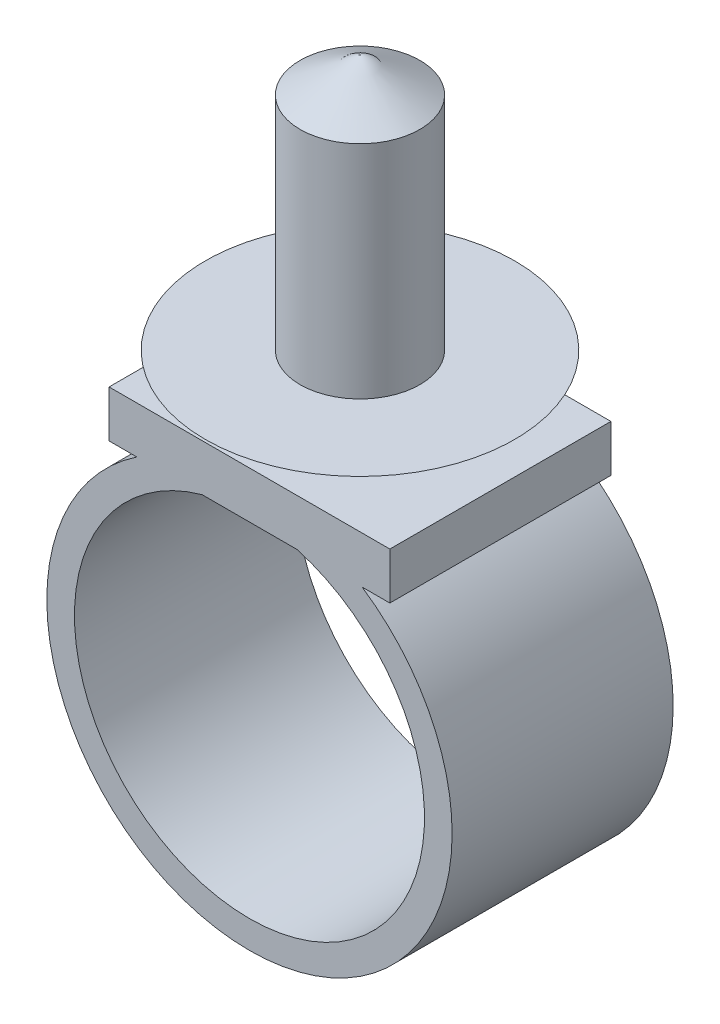
ISO-10303-21;
HEADER;
FILE_DESCRIPTION(('STEP AP214'),'2;1');
FILE_NAME('part.step','',(''),(''),'','','');
FILE_SCHEMA(('AUTOMOTIVE_DESIGN { 1 0 10303 214 1 1 1 1 }'));
ENDSEC;
DATA;
#1=APPLICATION_CONTEXT('core data for automotive mechanical design processes');
#2=APPLICATION_PROTOCOL_DEFINITION('international standard','automotive_design',2000,#1);
#3=PRODUCT_CONTEXT('',#1,'mechanical');
#4=PRODUCT('Part','Part','',(#3));
#5=PRODUCT_RELATED_PRODUCT_CATEGORY('part','',(#4));
#6=PRODUCT_DEFINITION_FORMATION('','',#4);
#7=PRODUCT_DEFINITION_CONTEXT('part definition',#1,'design');
#8=PRODUCT_DEFINITION('design','',#6,#7);
#9=PRODUCT_DEFINITION_SHAPE('','',#8);
#10=(LENGTH_UNIT() NAMED_UNIT(*) SI_UNIT(.MILLI.,.METRE.));
#11=(NAMED_UNIT(*) PLANE_ANGLE_UNIT() SI_UNIT($,.RADIAN.));
#12=(NAMED_UNIT(*) SI_UNIT($,.STERADIAN.) SOLID_ANGLE_UNIT());
#13=UNCERTAINTY_MEASURE_WITH_UNIT(LENGTH_MEASURE(1.E-05),#10,'distance_accuracy_value','');
#14=(GEOMETRIC_REPRESENTATION_CONTEXT(3) GLOBAL_UNCERTAINTY_ASSIGNED_CONTEXT((#13)) GLOBAL_UNIT_ASSIGNED_CONTEXT((#10,
#11,#12)) REPRESENTATION_CONTEXT('',''));
#15=CARTESIAN_POINT('',(0.,0.,0.));
#16=DIRECTION('',(0.,0.,1.));
#17=DIRECTION('',(1.,0.,0.));
#18=AXIS2_PLACEMENT_3D('',#15,#16,#17);
#19=CARTESIAN_POINT('',(0.,0.,12.));
#20=DIRECTION('',(0.,0.,1.));
#21=DIRECTION('',(1.,0.,0.));
#22=AXIS2_PLACEMENT_3D('',#19,#20,#21);
#23=PLANE('',#22);
#24=CARTESIAN_POINT('',(0.,0.,12.));
#25=DIRECTION('',(0.,0.,1.));
#26=DIRECTION('',(1.,0.,0.));
#27=AXIS2_PLACEMENT_3D('',#24,#25,#26);
#28=CIRCLE('',#27,9.5);
#29=CARTESIAN_POINT('',(-2.57628880368642,9.144,12.));
#30=VERTEX_POINT('',#29);
#31=CARTESIAN_POINT('',(2.57628880368642,9.144,12.));
#32=VERTEX_POINT('',#31);
#33=EDGE_CURVE('E185',#30,#32,#28,.T.);
#34=ORIENTED_EDGE('',*,*,#33,.F.);
#35=DIRECTION('',(1.,0.,0.));
#36=VECTOR('',#35,1.);
#37=CARTESIAN_POINT('',(7.62,9.144,12.));
#38=LINE('',#37,#36);
#39=EDGE_CURVE('E155',#30,#32,#38,.T.);
#40=ORIENTED_EDGE('',*,*,#39,.T.);
#41=EDGE_LOOP('',(#34,#40));
#42=FACE_BOUND('',#41,.T.);
#43=CARTESIAN_POINT('',(-7.62,9.144,12.));
#44=VERTEX_POINT('',#43);
#45=CARTESIAN_POINT('',(-6.11451257256046,9.144,12.));
#46=VERTEX_POINT('',#45);
#47=EDGE_CURVE('E150',#44,#46,#38,.T.);
#48=ORIENTED_EDGE('',*,*,#47,.T.);
#49=CARTESIAN_POINT('',(0.,0.,12.));
#50=DIRECTION('',(0.,0.,1.));
#51=DIRECTION('',(1.,0.,0.));
#52=AXIS2_PLACEMENT_3D('',#49,#50,#51);
#53=CIRCLE('',#52,11.);
#54=CARTESIAN_POINT('',(6.11451257256047,9.144,12.));
#55=VERTEX_POINT('',#54);
#56=EDGE_CURVE('E191',#46,#55,#53,.T.);
#57=ORIENTED_EDGE('',*,*,#56,.T.);
#58=CARTESIAN_POINT('',(7.62,9.144,12.));
#59=VERTEX_POINT('',#58);
#60=EDGE_CURVE('E61',#55,#59,#38,.T.);
#61=ORIENTED_EDGE('',*,*,#60,.T.);
#62=DIRECTION('',(0.,-1.,0.));
#63=VECTOR('',#62,1.);
#64=CARTESIAN_POINT('',(7.62,11.684,12.));
#65=LINE('',#64,#63);
#66=CARTESIAN_POINT('',(7.62,11.684,12.));
#67=VERTEX_POINT('',#66);
#68=EDGE_CURVE('E166',#67,#59,#65,.T.);
#69=ORIENTED_EDGE('',*,*,#68,.F.);
#70=DIRECTION('',(1.,0.,0.));
#71=VECTOR('',#70,1.);
#72=CARTESIAN_POINT('',(7.62,11.684,12.));
#73=LINE('',#72,#71);
#74=CARTESIAN_POINT('',(-7.62,11.684,12.));
#75=VERTEX_POINT('',#74);
#76=EDGE_CURVE('E140',#75,#67,#73,.T.);
#77=ORIENTED_EDGE('',*,*,#76,.F.);
#78=DIRECTION('',(0.,-1.,0.));
#79=VECTOR('',#78,1.);
#80=CARTESIAN_POINT('',(-7.62,11.684,12.));
#81=LINE('',#80,#79);
#82=EDGE_CURVE('E170',#75,#44,#81,.T.);
#83=ORIENTED_EDGE('',*,*,#82,.T.);
#84=EDGE_LOOP('',(#48,#57,#61,#69,#77,#83));
#85=FACE_BOUND('',#84,.T.);
#86=ADVANCED_FACE('F43',(#42,#85),#23,.T.);
#87=CARTESIAN_POINT('',(0.,0.,0.));
#88=DIRECTION('',(0.,0.,1.));
#89=DIRECTION('',(1.,0.,0.));
#90=AXIS2_PLACEMENT_3D('',#87,#88,#89);
#91=PLANE('',#90);
#92=DIRECTION('',(-1.,0.,0.));
#93=VECTOR('',#92,1.);
#94=CARTESIAN_POINT('',(0.,9.144,0.));
#95=LINE('',#94,#93);
#96=CARTESIAN_POINT('',(2.57628880368642,9.144,0.));
#97=VERTEX_POINT('',#96);
#98=CARTESIAN_POINT('',(-2.57628880368642,9.144,0.));
#99=VERTEX_POINT('',#98);
#100=EDGE_CURVE('E162',#97,#99,#95,.T.);
#101=ORIENTED_EDGE('',*,*,#100,.T.);
#102=CARTESIAN_POINT('',(0.,0.,0.));
#103=DIRECTION('',(0.,0.,1.));
#104=DIRECTION('',(1.,0.,0.));
#105=AXIS2_PLACEMENT_3D('',#102,#103,#104);
#106=CIRCLE('',#105,9.5);
#107=EDGE_CURVE('E69',#99,#97,#106,.T.);
#108=ORIENTED_EDGE('',*,*,#107,.T.);
#109=EDGE_LOOP('',(#101,#108));
#110=FACE_BOUND('',#109,.T.);
#111=CARTESIAN_POINT('',(0.,0.,0.));
#112=DIRECTION('',(0.,0.,1.));
#113=DIRECTION('',(1.,0.,0.));
#114=AXIS2_PLACEMENT_3D('',#111,#112,#113);
#115=CIRCLE('',#114,11.);
#116=CARTESIAN_POINT('',(-6.11451257256046,9.144,0.));
#117=VERTEX_POINT('',#116);
#118=CARTESIAN_POINT('',(6.11451257256046,9.144,0.));
#119=VERTEX_POINT('',#118);
#120=EDGE_CURVE('E188',#117,#119,#115,.T.);
#121=ORIENTED_EDGE('',*,*,#120,.F.);
#122=CARTESIAN_POINT('',(-7.62,9.144,0.));
#123=VERTEX_POINT('',#122);
#124=EDGE_CURVE('E158',#117,#123,#95,.T.);
#125=ORIENTED_EDGE('',*,*,#124,.T.);
#126=DIRECTION('',(0.,-1.,0.));
#127=VECTOR('',#126,1.);
#128=CARTESIAN_POINT('',(-7.62,11.684,0.));
#129=LINE('',#128,#127);
#130=CARTESIAN_POINT('',(-7.62,11.684,0.));
#131=VERTEX_POINT('',#130);
#132=EDGE_CURVE('E174',#131,#123,#129,.T.);
#133=ORIENTED_EDGE('',*,*,#132,.F.);
#134=DIRECTION('',(-1.,0.,0.));
#135=VECTOR('',#134,1.);
#136=CARTESIAN_POINT('',(-7.62,11.684,0.));
#137=LINE('',#136,#135);
#138=CARTESIAN_POINT('',(7.62,11.684,0.));
#139=VERTEX_POINT('',#138);
#140=EDGE_CURVE('E132',#139,#131,#137,.T.);
#141=ORIENTED_EDGE('',*,*,#140,.F.);
#142=DIRECTION('',(0.,-1.,0.));
#143=VECTOR('',#142,1.);
#144=CARTESIAN_POINT('',(7.62,11.684,0.));
#145=LINE('',#144,#143);
#146=CARTESIAN_POINT('',(7.62,9.144,0.));
#147=VERTEX_POINT('',#146);
#148=EDGE_CURVE('E147',#139,#147,#145,.T.);
#149=ORIENTED_EDGE('',*,*,#148,.T.);
#150=EDGE_CURVE('E137',#147,#119,#95,.T.);
#151=ORIENTED_EDGE('',*,*,#150,.T.);
#152=EDGE_LOOP('',(#121,#125,#133,#141,#149,#151));
#153=FACE_BOUND('',#152,.T.);
#154=ADVANCED_FACE('F209',(#110,#153),#91,.F.);
#155=CARTESIAN_POINT('',(0.,0.,12.));
#156=DIRECTION('',(0.,0.,-1.));
#157=DIRECTION('',(-1.,0.,0.));
#158=AXIS2_PLACEMENT_3D('',#155,#156,#157);
#159=CYLINDRICAL_SURFACE('',#158,11.);
#160=ORIENTED_EDGE('',*,*,#56,.F.);
#161=DIRECTION('',(0.,0.,-1.));
#162=VECTOR('',#161,1.);
#163=CARTESIAN_POINT('',(-6.11451257256047,9.144,12.));
#164=LINE('',#163,#162);
#165=EDGE_CURVE('E181',#46,#117,#164,.T.);
#166=ORIENTED_EDGE('',*,*,#165,.T.);
#167=ORIENTED_EDGE('',*,*,#120,.T.);
#168=DIRECTION('',(0.,0.,-1.));
#169=VECTOR('',#168,1.);
#170=CARTESIAN_POINT('',(6.11451257256047,9.144,12.));
#171=LINE('',#170,#169);
#172=EDGE_CURVE('E178',#119,#55,#171,.F.);
#173=ORIENTED_EDGE('',*,*,#172,.T.);
#174=EDGE_LOOP('',(#160,#166,#167,#173));
#175=FACE_BOUND('',#174,.T.);
#176=ADVANCED_FACE('F45',(#175),#159,.T.);
#177=CARTESIAN_POINT('',(0.,0.,12.));
#178=DIRECTION('',(0.,0.,-1.));
#179=DIRECTION('',(-1.,0.,0.));
#180=AXIS2_PLACEMENT_3D('',#177,#178,#179);
#181=CYLINDRICAL_SURFACE('',#180,9.5);
#182=DIRECTION('',(0.,0.,-1.));
#183=VECTOR('',#182,1.);
#184=CARTESIAN_POINT('',(-2.57628880368642,9.144,12.));
#185=LINE('',#184,#183);
#186=EDGE_CURVE('E47',#30,#99,#185,.T.);
#187=ORIENTED_EDGE('',*,*,#186,.F.);
#188=ORIENTED_EDGE('',*,*,#33,.T.);
#189=DIRECTION('',(0.,0.,-1.));
#190=VECTOR('',#189,1.);
#191=CARTESIAN_POINT('',(2.57628880368642,9.144,12.));
#192=LINE('',#191,#190);
#193=EDGE_CURVE('E195',#97,#32,#192,.F.);
#194=ORIENTED_EDGE('',*,*,#193,.F.);
#195=ORIENTED_EDGE('',*,*,#107,.F.);
#196=EDGE_LOOP('',(#187,#188,#194,#195));
#197=FACE_BOUND('',#196,.T.);
#198=ADVANCED_FACE('F253',(#197),#181,.F.);
#199=CARTESIAN_POINT('',(0.,9.144,0.));
#200=DIRECTION('',(0.,-1.,0.));
#201=DIRECTION('',(0.,0.,-1.));
#202=AXIS2_PLACEMENT_3D('',#199,#200,#201);
#203=PLANE('',#202);
#204=ORIENTED_EDGE('',*,*,#39,.F.);
#205=ORIENTED_EDGE('',*,*,#186,.T.);
#206=ORIENTED_EDGE('',*,*,#100,.F.);
#207=ORIENTED_EDGE('',*,*,#193,.T.);
#208=EDGE_LOOP('',(#204,#205,#206,#207));
#209=FACE_BOUND('',#208,.T.);
#210=ADVANCED_FACE('F206',(#209),#203,.T.);
#211=ORIENTED_EDGE('',*,*,#165,.F.);
#212=ORIENTED_EDGE('',*,*,#47,.F.);
#213=DIRECTION('',(0.,0.,1.));
#214=VECTOR('',#213,1.);
#215=CARTESIAN_POINT('',(-7.62,9.144,12.));
#216=LINE('',#215,#214);
#217=EDGE_CURVE('E126',#123,#44,#216,.T.);
#218=ORIENTED_EDGE('',*,*,#217,.F.);
#219=ORIENTED_EDGE('',*,*,#124,.F.);
#220=EDGE_LOOP('',(#211,#212,#218,#219));
#221=FACE_BOUND('',#220,.T.);
#222=ADVANCED_FACE('F218',(#221),#203,.T.);
#223=ORIENTED_EDGE('',*,*,#172,.F.);
#224=ORIENTED_EDGE('',*,*,#150,.F.);
#225=DIRECTION('',(0.,0.,-1.));
#226=VECTOR('',#225,1.);
#227=CARTESIAN_POINT('',(7.62,9.144,0.));
#228=LINE('',#227,#226);
#229=EDGE_CURVE('E154',#59,#147,#228,.T.);
#230=ORIENTED_EDGE('',*,*,#229,.F.);
#231=ORIENTED_EDGE('',*,*,#60,.F.);
#232=EDGE_LOOP('',(#223,#224,#230,#231));
#233=FACE_BOUND('',#232,.T.);
#234=ADVANCED_FACE('F229',(#233),#203,.T.);
#235=CARTESIAN_POINT('',(-7.62,11.684,12.));
#236=DIRECTION('',(1.,0.,0.));
#237=DIRECTION('',(0.,0.,-1.));
#238=AXIS2_PLACEMENT_3D('',#235,#236,#237);
#239=PLANE('',#238);
#240=ORIENTED_EDGE('',*,*,#217,.T.);
#241=ORIENTED_EDGE('',*,*,#82,.F.);
#242=DIRECTION('',(0.,0.,1.));
#243=VECTOR('',#242,1.);
#244=CARTESIAN_POINT('',(-7.62,11.684,12.));
#245=LINE('',#244,#243);
#246=EDGE_CURVE('E136',#131,#75,#245,.T.);
#247=ORIENTED_EDGE('',*,*,#246,.F.);
#248=ORIENTED_EDGE('',*,*,#132,.T.);
#249=EDGE_LOOP('',(#240,#241,#247,#248));
#250=FACE_BOUND('',#249,.T.);
#251=ADVANCED_FACE('F221',(#250),#239,.F.);
#252=CARTESIAN_POINT('',(7.62,11.684,0.));
#253=DIRECTION('',(-1.,0.,0.));
#254=DIRECTION('',(0.,0.,1.));
#255=AXIS2_PLACEMENT_3D('',#252,#253,#254);
#256=PLANE('',#255);
#257=ORIENTED_EDGE('',*,*,#229,.T.);
#258=ORIENTED_EDGE('',*,*,#148,.F.);
#259=DIRECTION('',(0.,0.,-1.));
#260=VECTOR('',#259,1.);
#261=CARTESIAN_POINT('',(7.62,11.684,0.));
#262=LINE('',#261,#260);
#263=EDGE_CURVE('E143',#67,#139,#262,.T.);
#264=ORIENTED_EDGE('',*,*,#263,.F.);
#265=ORIENTED_EDGE('',*,*,#68,.T.);
#266=EDGE_LOOP('',(#257,#258,#264,#265));
#267=FACE_BOUND('',#266,.T.);
#268=ADVANCED_FACE('F234',(#267),#256,.F.);
#269=CARTESIAN_POINT('',(0.,11.684,0.));
#270=DIRECTION('',(0.,-1.,0.));
#271=DIRECTION('',(0.,0.,-1.));
#272=AXIS2_PLACEMENT_3D('',#269,#270,#271);
#273=PLANE('',#272);
#274=CARTESIAN_POINT('',(0.,11.684,6.));
#275=DIRECTION('',(0.,1.,0.));
#276=DIRECTION('',(0.,0.,1.));
#277=AXIS2_PLACEMENT_3D('',#274,#275,#276);
#278=CIRCLE('',#277,4.);
#279=CARTESIAN_POINT('',(0.,11.684,10.));
#280=VERTEX_POINT('',#279);
#281=EDGE_CURVE('E53',#280,#280,#278,.T.);
#282=ORIENTED_EDGE('',*,*,#281,.F.);
#283=EDGE_LOOP('',(#282));
#284=FACE_BOUND('',#283,.T.);
#285=ORIENTED_EDGE('',*,*,#140,.T.);
#286=ORIENTED_EDGE('',*,*,#246,.T.);
#287=ORIENTED_EDGE('',*,*,#76,.T.);
#288=ORIENTED_EDGE('',*,*,#263,.T.);
#289=EDGE_LOOP('',(#285,#286,#287,#288));
#290=FACE_BOUND('',#289,.T.);
#291=ADVANCED_FACE('F224',(#284,#290),#273,.F.);
#292=CARTESIAN_POINT('',(0.,11.684,6.));
#293=DIRECTION('',(0.,1.,0.));
#294=DIRECTION('',(0.,0.,1.));
#295=AXIS2_PLACEMENT_3D('',#292,#293,#294);
#296=CONICAL_SURFACE('',#295,4.,1.0471975511966);
#297=CARTESIAN_POINT('',(0.,14.224,6.));
#298=DIRECTION('',(0.,1.,0.));
#299=DIRECTION('',(0.,0.,1.));
#300=AXIS2_PLACEMENT_3D('',#297,#298,#299);
#301=CIRCLE('',#300,8.39940905122497);
#302=CARTESIAN_POINT('',(0.,14.224,14.399409051225));
#303=VERTEX_POINT('',#302);
#304=EDGE_CURVE('E122',#303,#303,#301,.T.);
#305=ORIENTED_EDGE('',*,*,#304,.F.);
#306=EDGE_LOOP('',(#305));
#307=FACE_BOUND('',#306,.T.);
#308=ORIENTED_EDGE('',*,*,#281,.T.);
#309=EDGE_LOOP('',(#308));
#310=FACE_BOUND('',#309,.T.);
#311=ADVANCED_FACE('F241',(#307,#310),#296,.T.);
#312=CARTESIAN_POINT('',(0.,14.224,6.));
#313=DIRECTION('',(0.,1.,0.));
#314=DIRECTION('',(0.,0.,1.));
#315=AXIS2_PLACEMENT_3D('',#312,#313,#314);
#316=PLANE('',#315);
#317=CARTESIAN_POINT('',(0.,14.224,6.));
#318=DIRECTION('',(0.,1.,0.));
#319=DIRECTION('',(0.,0.,1.));
#320=AXIS2_PLACEMENT_3D('',#317,#318,#319);
#321=CIRCLE('',#320,3.25);
#322=CARTESIAN_POINT('',(0.,14.224,9.25));
#323=VERTEX_POINT('',#322);
#324=EDGE_CURVE('E11',#323,#323,#321,.T.);
#325=ORIENTED_EDGE('',*,*,#324,.F.);
#326=EDGE_LOOP('',(#325));
#327=FACE_BOUND('',#326,.T.);
#328=ORIENTED_EDGE('',*,*,#304,.T.);
#329=EDGE_LOOP('',(#328));
#330=FACE_BOUND('',#329,.T.);
#331=ADVANCED_FACE('F336',(#327,#330),#316,.T.);
#332=CARTESIAN_POINT('',(0.,26.224,6.));
#333=DIRECTION('',(0.,-1.,0.));
#334=DIRECTION('',(0.,0.,-1.));
#335=AXIS2_PLACEMENT_3D('',#332,#333,#334);
#336=CYLINDRICAL_SURFACE('',#335,3.25);
#337=CARTESIAN_POINT('',(0.,26.224,6.));
#338=DIRECTION('',(0.,1.,0.));
#339=DIRECTION('',(0.,0.,1.));
#340=AXIS2_PLACEMENT_3D('',#337,#338,#339);
#341=CIRCLE('',#340,3.25);
#342=CARTESIAN_POINT('',(0.,26.224,9.25));
#343=VERTEX_POINT('',#342);
#344=EDGE_CURVE('E119',#343,#343,#341,.T.);
#345=ORIENTED_EDGE('',*,*,#344,.F.);
#346=EDGE_LOOP('',(#345));
#347=FACE_BOUND('',#346,.T.);
#348=ORIENTED_EDGE('',*,*,#324,.T.);
#349=EDGE_LOOP('',(#348));
#350=FACE_BOUND('',#349,.T.);
#351=ADVANCED_FACE('F115',(#347,#350),#336,.T.);
#352=CARTESIAN_POINT('',(0.,26.224,6.));
#353=DIRECTION('',(0.,-1.,0.));
#354=DIRECTION('',(0.,0.,1.));
#355=AXIS2_PLACEMENT_3D('',#352,#353,#354);
#356=CONICAL_SURFACE('',#355,3.25,1.0471975511966);
#357=CARTESIAN_POINT('',(0.,28.1003883748663,6.));
#358=VERTEX_POINT('',#357);
#359=VERTEX_LOOP('',#358);
#360=FACE_BOUND('',#359,.T.);
#361=ORIENTED_EDGE('',*,*,#344,.T.);
#362=EDGE_LOOP('',(#361));
#363=FACE_BOUND('',#362,.T.);
#364=ADVANCED_FACE('F112',(#360,#363),#356,.T.);
#365=CLOSED_SHELL('',(#86,#154,#176,#198,#210,#222,#234,#251,#268,#291,#311,#331,#351,#364));
#366=MANIFOLD_SOLID_BREP('B2',#365);
#367=ADVANCED_BREP_SHAPE_REPRESENTATION('',(#18,#366),#14);
#368=SHAPE_DEFINITION_REPRESENTATION(#9,#367);
ENDSEC;
END-ISO-10303-21;
